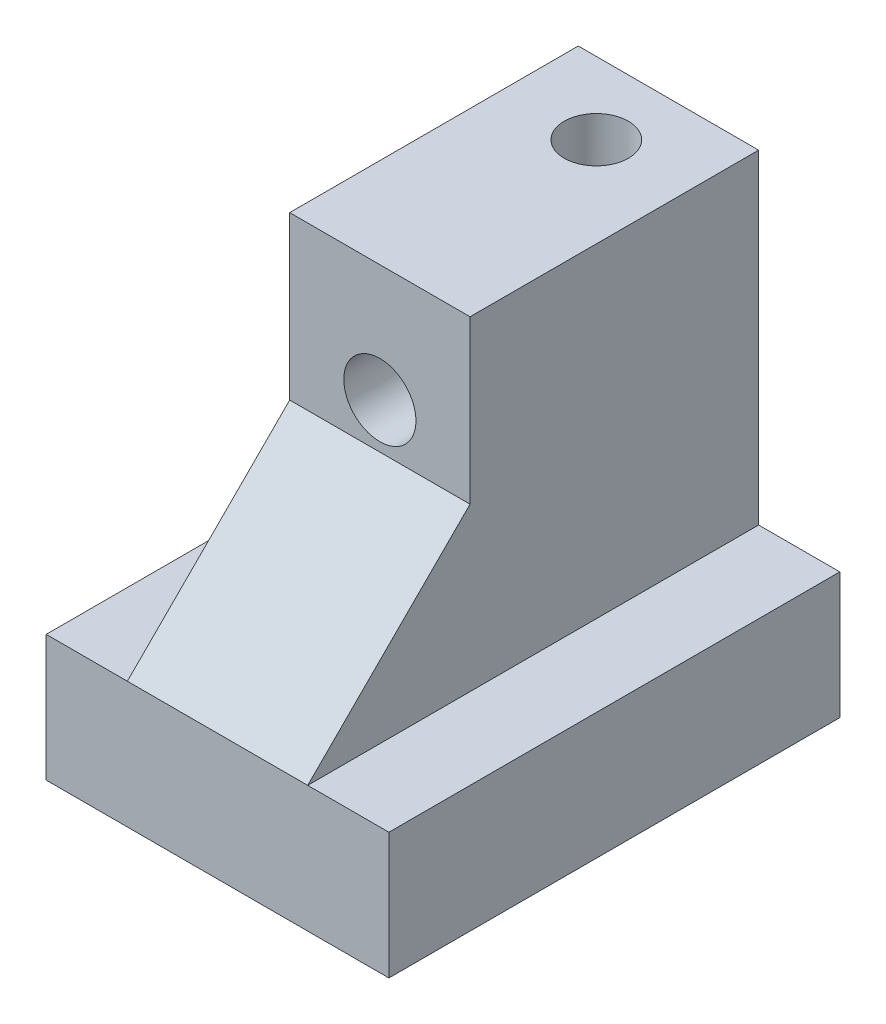
ISO-10303-21;
HEADER;
FILE_DESCRIPTION(('STEP AP214'),'2;1');
FILE_NAME('part.step','',(''),(''),'','','');
FILE_SCHEMA(('AUTOMOTIVE_DESIGN { 1 0 10303 214 1 1 1 1 }'));
ENDSEC;
DATA;
#1=APPLICATION_CONTEXT('core data for automotive mechanical design processes');
#2=APPLICATION_PROTOCOL_DEFINITION('international standard','automotive_design',2000,#1);
#3=PRODUCT_CONTEXT('',#1,'mechanical');
#4=PRODUCT('Part','Part','',(#3));
#5=PRODUCT_RELATED_PRODUCT_CATEGORY('part','',(#4));
#6=PRODUCT_DEFINITION_FORMATION('','',#4);
#7=PRODUCT_DEFINITION_CONTEXT('part definition',#1,'design');
#8=PRODUCT_DEFINITION('design','',#6,#7);
#9=PRODUCT_DEFINITION_SHAPE('','',#8);
#10=(LENGTH_UNIT() NAMED_UNIT(*) SI_UNIT(.MILLI.,.METRE.));
#11=(NAMED_UNIT(*) PLANE_ANGLE_UNIT() SI_UNIT($,.RADIAN.));
#12=(NAMED_UNIT(*) SI_UNIT($,.STERADIAN.) SOLID_ANGLE_UNIT());
#13=UNCERTAINTY_MEASURE_WITH_UNIT(LENGTH_MEASURE(1.E-05),#10,'distance_accuracy_value','');
#14=(GEOMETRIC_REPRESENTATION_CONTEXT(3) GLOBAL_UNCERTAINTY_ASSIGNED_CONTEXT((#13)) GLOBAL_UNIT_ASSIGNED_CONTEXT((#10,
#11,#12)) REPRESENTATION_CONTEXT('',''));
#15=CARTESIAN_POINT('',(0.,0.,0.));
#16=DIRECTION('',(0.,0.,1.));
#17=DIRECTION('',(1.,0.,0.));
#18=AXIS2_PLACEMENT_3D('',#15,#16,#17);
#19=CARTESIAN_POINT('',(-6.0325,2.2225,15.875));
#20=DIRECTION('',(0.,-1.,0.));
#21=DIRECTION('',(0.,0.,-1.));
#22=AXIS2_PLACEMENT_3D('',#19,#20,#21);
#23=PLANE('',#22);
#24=DIRECTION('',(0.,0.,-1.));
#25=VECTOR('',#24,1.);
#26=CARTESIAN_POINT('',(3.175,2.2225,10.16));
#27=LINE('',#26,#25);
#28=CARTESIAN_POINT('',(3.175,2.2225,15.875));
#29=VERTEX_POINT('',#28);
#30=CARTESIAN_POINT('',(3.17499999999999,2.2225,0.));
#31=VERTEX_POINT('',#30);
#32=EDGE_CURVE('E57',#29,#31,#27,.T.);
#33=ORIENTED_EDGE('',*,*,#32,.F.);
#34=DIRECTION('',(-1.,0.,0.));
#35=VECTOR('',#34,1.);
#36=CARTESIAN_POINT('',(-6.0325,2.2225,15.875));
#37=LINE('',#36,#35);
#38=CARTESIAN_POINT('',(6.0325,2.2225,15.875));
#39=VERTEX_POINT('',#38);
#40=EDGE_CURVE('E156',#39,#29,#37,.T.);
#41=ORIENTED_EDGE('',*,*,#40,.F.);
#42=DIRECTION('',(0.,0.,-1.));
#43=VECTOR('',#42,1.);
#44=CARTESIAN_POINT('',(6.0325,2.2225,15.875));
#45=LINE('',#44,#43);
#46=CARTESIAN_POINT('',(6.0325,2.2225,0.));
#47=VERTEX_POINT('',#46);
#48=EDGE_CURVE('E175',#39,#47,#45,.T.);
#49=ORIENTED_EDGE('',*,*,#48,.T.);
#50=DIRECTION('',(-1.,0.,0.));
#51=VECTOR('',#50,1.);
#52=CARTESIAN_POINT('',(-6.0325,2.2225,0.));
#53=LINE('',#52,#51);
#54=EDGE_CURVE('E173',#47,#31,#53,.T.);
#55=ORIENTED_EDGE('',*,*,#54,.T.);
#56=EDGE_LOOP('',(#33,#41,#49,#55));
#57=FACE_BOUND('',#56,.T.);
#58=ADVANCED_FACE('F35',(#57),#23,.F.);
#59=CARTESIAN_POINT('',(-3.175,2.2225,15.875));
#60=VERTEX_POINT('',#59);
#61=CARTESIAN_POINT('',(-6.0325,2.2225,15.875));
#62=VERTEX_POINT('',#61);
#63=EDGE_CURVE('E154',#60,#62,#37,.T.);
#64=ORIENTED_EDGE('',*,*,#63,.F.);
#65=DIRECTION('',(0.,0.,1.));
#66=VECTOR('',#65,1.);
#67=CARTESIAN_POINT('',(-3.175,2.2225,10.16));
#68=LINE('',#67,#66);
#69=CARTESIAN_POINT('',(-3.175,2.2225,0.));
#70=VERTEX_POINT('',#69);
#71=EDGE_CURVE('E49',#70,#60,#68,.T.);
#72=ORIENTED_EDGE('',*,*,#71,.F.);
#73=CARTESIAN_POINT('',(-6.0325,2.2225,0.));
#74=VERTEX_POINT('',#73);
#75=EDGE_CURVE('E130',#70,#74,#53,.T.);
#76=ORIENTED_EDGE('',*,*,#75,.T.);
#77=DIRECTION('',(0.,0.,-1.));
#78=VECTOR('',#77,1.);
#79=CARTESIAN_POINT('',(-6.0325,2.2225,15.875));
#80=LINE('',#79,#78);
#81=EDGE_CURVE('E179',#62,#74,#80,.T.);
#82=ORIENTED_EDGE('',*,*,#81,.F.);
#83=EDGE_LOOP('',(#64,#72,#76,#82));
#84=FACE_BOUND('',#83,.T.);
#85=ADVANCED_FACE('F207',(#84),#23,.F.);
#86=CARTESIAN_POINT('',(6.0325,-2.2225,15.875));
#87=DIRECTION('',(-1.,0.,0.));
#88=DIRECTION('',(0.,0.,1.));
#89=AXIS2_PLACEMENT_3D('',#86,#87,#88);
#90=PLANE('',#89);
#91=DIRECTION('',(0.,1.,0.));
#92=VECTOR('',#91,1.);
#93=CARTESIAN_POINT('',(6.0325,-2.2225,0.));
#94=LINE('',#93,#92);
#95=CARTESIAN_POINT('',(6.0325,-2.2225,0.));
#96=VERTEX_POINT('',#95);
#97=EDGE_CURVE('E127',#96,#47,#94,.T.);
#98=ORIENTED_EDGE('',*,*,#97,.T.);
#99=ORIENTED_EDGE('',*,*,#48,.F.);
#100=DIRECTION('',(0.,1.,0.));
#101=VECTOR('',#100,1.);
#102=CARTESIAN_POINT('',(6.0325,-2.2225,15.875));
#103=LINE('',#102,#101);
#104=CARTESIAN_POINT('',(6.0325,-2.2225,15.875));
#105=VERTEX_POINT('',#104);
#106=EDGE_CURVE('E151',#105,#39,#103,.T.);
#107=ORIENTED_EDGE('',*,*,#106,.F.);
#108=DIRECTION('',(0.,0.,-1.));
#109=VECTOR('',#108,1.);
#110=CARTESIAN_POINT('',(6.0325,-2.2225,15.875));
#111=LINE('',#110,#109);
#112=EDGE_CURVE('E163',#105,#96,#111,.T.);
#113=ORIENTED_EDGE('',*,*,#112,.T.);
#114=EDGE_LOOP('',(#98,#99,#107,#113));
#115=FACE_BOUND('',#114,.T.);
#116=ADVANCED_FACE('F199',(#115),#90,.F.);
#117=CARTESIAN_POINT('',(-6.0325,-2.2225,15.875));
#118=DIRECTION('',(1.,0.,0.));
#119=DIRECTION('',(0.,0.,-1.));
#120=AXIS2_PLACEMENT_3D('',#117,#118,#119);
#121=PLANE('',#120);
#122=DIRECTION('',(0.,-1.,0.));
#123=VECTOR('',#122,1.);
#124=CARTESIAN_POINT('',(-6.0325,-2.2225,0.));
#125=LINE('',#124,#123);
#126=CARTESIAN_POINT('',(-6.0325,-2.2225,0.));
#127=VERTEX_POINT('',#126);
#128=EDGE_CURVE('E167',#74,#127,#125,.T.);
#129=ORIENTED_EDGE('',*,*,#128,.T.);
#130=DIRECTION('',(0.,0.,-1.));
#131=VECTOR('',#130,1.);
#132=CARTESIAN_POINT('',(-6.0325,-2.2225,15.875));
#133=LINE('',#132,#131);
#134=CARTESIAN_POINT('',(-6.0325,-2.2225,15.875));
#135=VERTEX_POINT('',#134);
#136=EDGE_CURVE('E182',#135,#127,#133,.T.);
#137=ORIENTED_EDGE('',*,*,#136,.F.);
#138=DIRECTION('',(0.,-1.,0.));
#139=VECTOR('',#138,1.);
#140=CARTESIAN_POINT('',(-6.0325,-2.2225,15.875));
#141=LINE('',#140,#139);
#142=EDGE_CURVE('E159',#62,#135,#141,.T.);
#143=ORIENTED_EDGE('',*,*,#142,.F.);
#144=ORIENTED_EDGE('',*,*,#81,.T.);
#145=EDGE_LOOP('',(#129,#137,#143,#144));
#146=FACE_BOUND('',#145,.T.);
#147=ADVANCED_FACE('F192',(#146),#121,.F.);
#148=CARTESIAN_POINT('',(-6.0325,-2.2225,15.875));
#149=DIRECTION('',(0.,1.,0.));
#150=DIRECTION('',(0.,0.,1.));
#151=AXIS2_PLACEMENT_3D('',#148,#149,#150);
#152=PLANE('',#151);
#153=DIRECTION('',(1.,0.,0.));
#154=VECTOR('',#153,1.);
#155=CARTESIAN_POINT('',(-6.0325,-2.2225,0.));
#156=LINE('',#155,#154);
#157=EDGE_CURVE('E155',#127,#96,#156,.T.);
#158=ORIENTED_EDGE('',*,*,#157,.T.);
#159=ORIENTED_EDGE('',*,*,#112,.F.);
#160=DIRECTION('',(1.,0.,0.));
#161=VECTOR('',#160,1.);
#162=CARTESIAN_POINT('',(-6.0325,-2.2225,15.875));
#163=LINE('',#162,#161);
#164=EDGE_CURVE('E162',#135,#105,#163,.T.);
#165=ORIENTED_EDGE('',*,*,#164,.F.);
#166=ORIENTED_EDGE('',*,*,#136,.T.);
#167=EDGE_LOOP('',(#158,#159,#165,#166));
#168=FACE_BOUND('',#167,.T.);
#169=ADVANCED_FACE('F196',(#168),#152,.F.);
#170=CARTESIAN_POINT('',(0.,0.,15.875));
#171=DIRECTION('',(0.,0.,-1.));
#172=DIRECTION('',(-1.,0.,0.));
#173=AXIS2_PLACEMENT_3D('',#170,#171,#172);
#174=PLANE('',#173);
#175=ORIENTED_EDGE('',*,*,#106,.T.);
#176=ORIENTED_EDGE('',*,*,#40,.T.);
#177=EDGE_CURVE('E160',#29,#60,#37,.T.);
#178=ORIENTED_EDGE('',*,*,#177,.T.);
#179=ORIENTED_EDGE('',*,*,#63,.T.);
#180=ORIENTED_EDGE('',*,*,#142,.T.);
#181=ORIENTED_EDGE('',*,*,#164,.T.);
#182=EDGE_LOOP('',(#175,#176,#178,#179,#180,#181));
#183=FACE_BOUND('',#182,.T.);
#184=ADVANCED_FACE('F202',(#183),#174,.F.);
#185=CARTESIAN_POINT('',(0.,0.,0.));
#186=DIRECTION('',(0.,0.,-1.));
#187=DIRECTION('',(-1.,0.,0.));
#188=AXIS2_PLACEMENT_3D('',#185,#186,#187);
#189=PLANE('',#188);
#190=CARTESIAN_POINT('',(0.,9.525,0.));
#191=DIRECTION('',(0.,0.,-1.));
#192=DIRECTION('',(-1.,0.,0.));
#193=AXIS2_PLACEMENT_3D('',#190,#191,#192);
#194=CIRCLE('',#193,1.27);
#195=CARTESIAN_POINT('',(-1.27,9.525,0.));
#196=VERTEX_POINT('',#195);
#197=EDGE_CURVE('E211',#196,#196,#194,.T.);
#198=ORIENTED_EDGE('',*,*,#197,.F.);
#199=EDGE_LOOP('',(#198));
#200=FACE_BOUND('',#199,.T.);
#201=ORIENTED_EDGE('',*,*,#97,.F.);
#202=ORIENTED_EDGE('',*,*,#157,.F.);
#203=ORIENTED_EDGE('',*,*,#128,.F.);
#204=ORIENTED_EDGE('',*,*,#75,.F.);
#205=DIRECTION('',(0.,-1.,0.));
#206=VECTOR('',#205,1.);
#207=CARTESIAN_POINT('',(-3.175,13.6525,0.));
#208=LINE('',#207,#206);
#209=CARTESIAN_POINT('',(-3.175,13.6525,0.));
#210=VERTEX_POINT('',#209);
#211=EDGE_CURVE('E112',#210,#70,#208,.T.);
#212=ORIENTED_EDGE('',*,*,#211,.F.);
#213=DIRECTION('',(-1.,0.,0.));
#214=VECTOR('',#213,1.);
#215=CARTESIAN_POINT('',(-3.175,13.6525,0.));
#216=LINE('',#215,#214);
#217=CARTESIAN_POINT('',(3.175,13.6525,0.));
#218=VERTEX_POINT('',#217);
#219=EDGE_CURVE('E105',#218,#210,#216,.T.);
#220=ORIENTED_EDGE('',*,*,#219,.F.);
#221=DIRECTION('',(0.,-1.,0.));
#222=VECTOR('',#221,1.);
#223=CARTESIAN_POINT('',(3.175,13.6525,0.));
#224=LINE('',#223,#222);
#225=EDGE_CURVE('E110',#218,#31,#224,.T.);
#226=ORIENTED_EDGE('',*,*,#225,.T.);
#227=ORIENTED_EDGE('',*,*,#54,.F.);
#228=EDGE_LOOP('',(#201,#202,#203,#204,#212,#220,#226,#227));
#229=FACE_BOUND('',#228,.T.);
#230=ADVANCED_FACE('F108',(#200,#229),#189,.T.);
#231=CARTESIAN_POINT('',(3.175,13.6525,10.16));
#232=DIRECTION('',(-1.,0.,0.));
#233=DIRECTION('',(0.,0.,1.));
#234=AXIS2_PLACEMENT_3D('',#231,#232,#233);
#235=PLANE('',#234);
#236=ORIENTED_EDGE('',*,*,#32,.T.);
#237=ORIENTED_EDGE('',*,*,#225,.F.);
#238=DIRECTION('',(0.,0.,-1.));
#239=VECTOR('',#238,1.);
#240=CARTESIAN_POINT('',(3.175,13.6525,10.16));
#241=LINE('',#240,#239);
#242=CARTESIAN_POINT('',(3.175,13.6525,10.16));
#243=VERTEX_POINT('',#242);
#244=EDGE_CURVE('E116',#243,#218,#241,.T.);
#245=ORIENTED_EDGE('',*,*,#244,.F.);
#246=DIRECTION('',(0.,-1.,0.));
#247=VECTOR('',#246,1.);
#248=CARTESIAN_POINT('',(3.175,13.6525,10.16));
#249=LINE('',#248,#247);
#250=CARTESIAN_POINT('',(3.175,7.93750000000003,10.16));
#251=VERTEX_POINT('',#250);
#252=EDGE_CURVE('E147',#243,#251,#249,.T.);
#253=ORIENTED_EDGE('',*,*,#252,.T.);
#254=DIRECTION('',(0.,0.707106781186551,-0.707106781186544));
#255=VECTOR('',#254,1.);
#256=CARTESIAN_POINT('',(3.175,10.795,7.30250000000002));
#257=LINE('',#256,#255);
#258=EDGE_CURVE('E43',#251,#29,#257,.F.);
#259=ORIENTED_EDGE('',*,*,#258,.T.);
#260=EDGE_LOOP('',(#236,#237,#245,#253,#259));
#261=FACE_BOUND('',#260,.T.);
#262=ADVANCED_FACE('F126',(#261),#235,.F.);
#263=CARTESIAN_POINT('',(-3.175,13.6525,10.16));
#264=DIRECTION('',(1.,0.,0.));
#265=DIRECTION('',(0.,0.,-1.));
#266=AXIS2_PLACEMENT_3D('',#263,#264,#265);
#267=PLANE('',#266);
#268=ORIENTED_EDGE('',*,*,#71,.T.);
#269=DIRECTION('',(0.,-0.707106781186551,0.707106781186544));
#270=VECTOR('',#269,1.);
#271=CARTESIAN_POINT('',(-3.175,10.795,7.30250000000002));
#272=LINE('',#271,#270);
#273=CARTESIAN_POINT('',(-3.175,7.93750000000003,10.16));
#274=VERTEX_POINT('',#273);
#275=EDGE_CURVE('E11',#60,#274,#272,.F.);
#276=ORIENTED_EDGE('',*,*,#275,.T.);
#277=DIRECTION('',(0.,-1.,0.));
#278=VECTOR('',#277,1.);
#279=CARTESIAN_POINT('',(-3.175,13.6525,10.16));
#280=LINE('',#279,#278);
#281=CARTESIAN_POINT('',(-3.175,13.6525,10.16));
#282=VERTEX_POINT('',#281);
#283=EDGE_CURVE('E132',#282,#274,#280,.T.);
#284=ORIENTED_EDGE('',*,*,#283,.F.);
#285=DIRECTION('',(0.,0.,1.));
#286=VECTOR('',#285,1.);
#287=CARTESIAN_POINT('',(-3.175,13.6525,10.16));
#288=LINE('',#287,#286);
#289=EDGE_CURVE('E115',#210,#282,#288,.T.);
#290=ORIENTED_EDGE('',*,*,#289,.F.);
#291=ORIENTED_EDGE('',*,*,#211,.T.);
#292=EDGE_LOOP('',(#268,#276,#284,#290,#291));
#293=FACE_BOUND('',#292,.T.);
#294=ADVANCED_FACE('F208',(#293),#267,.F.);
#295=CARTESIAN_POINT('',(-3.175,13.6525,10.16));
#296=DIRECTION('',(0.,0.,-1.));
#297=DIRECTION('',(-1.,0.,0.));
#298=AXIS2_PLACEMENT_3D('',#295,#296,#297);
#299=PLANE('',#298);
#300=CARTESIAN_POINT('',(0.,9.525,10.16));
#301=DIRECTION('',(0.,0.,-1.));
#302=DIRECTION('',(-1.,0.,0.));
#303=AXIS2_PLACEMENT_3D('',#300,#301,#302);
#304=CIRCLE('',#303,1.27);
#305=CARTESIAN_POINT('',(-1.27,9.525,10.16));
#306=VERTEX_POINT('',#305);
#307=EDGE_CURVE('E141',#306,#306,#304,.T.);
#308=ORIENTED_EDGE('',*,*,#307,.T.);
#309=EDGE_LOOP('',(#308));
#310=FACE_BOUND('',#309,.T.);
#311=ORIENTED_EDGE('',*,*,#283,.T.);
#312=DIRECTION('',(1.,0.,0.));
#313=VECTOR('',#312,1.);
#314=CARTESIAN_POINT('',(3.175,7.93750000000003,10.16));
#315=LINE('',#314,#313);
#316=EDGE_CURVE('E178',#274,#251,#315,.T.);
#317=ORIENTED_EDGE('',*,*,#316,.T.);
#318=ORIENTED_EDGE('',*,*,#252,.F.);
#319=DIRECTION('',(1.,0.,0.));
#320=VECTOR('',#319,1.);
#321=CARTESIAN_POINT('',(-3.175,13.6525,10.16));
#322=LINE('',#321,#320);
#323=EDGE_CURVE('E121',#282,#243,#322,.T.);
#324=ORIENTED_EDGE('',*,*,#323,.F.);
#325=EDGE_LOOP('',(#311,#317,#318,#324));
#326=FACE_BOUND('',#325,.T.);
#327=ADVANCED_FACE('F263',(#310,#326),#299,.F.);
#328=CARTESIAN_POINT('',(0.,13.6525,0.));
#329=DIRECTION('',(0.,-1.,0.));
#330=DIRECTION('',(0.,0.,-1.));
#331=AXIS2_PLACEMENT_3D('',#328,#329,#330);
#332=PLANE('',#331);
#333=CARTESIAN_POINT('',(0.,13.6525,2.54));
#334=DIRECTION('',(0.,1.,0.));
#335=DIRECTION('',(0.,0.,1.));
#336=AXIS2_PLACEMENT_3D('',#333,#334,#335);
#337=CIRCLE('',#336,1.13029999999999);
#338=CARTESIAN_POINT('',(0.,13.6525,3.67029999999999));
#339=VERTEX_POINT('',#338);
#340=EDGE_CURVE('E221',#339,#339,#337,.T.);
#341=ORIENTED_EDGE('',*,*,#340,.F.);
#342=EDGE_LOOP('',(#341));
#343=FACE_BOUND('',#342,.T.);
#344=ORIENTED_EDGE('',*,*,#244,.T.);
#345=ORIENTED_EDGE('',*,*,#219,.T.);
#346=ORIENTED_EDGE('',*,*,#289,.T.);
#347=ORIENTED_EDGE('',*,*,#323,.T.);
#348=EDGE_LOOP('',(#344,#345,#346,#347));
#349=FACE_BOUND('',#348,.T.);
#350=ADVANCED_FACE('F119',(#343,#349),#332,.F.);
#351=CARTESIAN_POINT('',(0.,9.525,15.875));
#352=DIRECTION('',(0.,0.,-1.));
#353=DIRECTION('',(-1.,0.,0.));
#354=AXIS2_PLACEMENT_3D('',#351,#352,#353);
#355=CYLINDRICAL_SURFACE('',#354,1.27);
#356=CARTESIAN_POINT('',(0.,10.795,3.67029999999999));
#357=CARTESIAN_POINT('',(0.0525214488881809,10.7949956889699,3.6702956249461));
#358=CARTESIAN_POINT('',(0.105118560895679,10.7917091381884,3.66660626555714));
#359=CARTESIAN_POINT('',(0.208583212691276,10.778844621461,3.65212185829814));
#360=CARTESIAN_POINT('',(0.259446677815284,10.7692527821927,3.64131114142573));
#361=CARTESIAN_POINT('',(0.357622274200163,10.7446518458602,3.61343904594019));
#362=CARTESIAN_POINT('',(0.404956120569466,10.7296798706134,3.59642048828165));
#363=CARTESIAN_POINT('',(0.495580758055982,10.6953218834413,3.55706587316357));
#364=CARTESIAN_POINT('',(0.538871192807762,10.675935482968,3.53472934762033));
#365=CARTESIAN_POINT('',(0.637191764307581,10.625464973188,3.47595519796252));
#366=CARTESIAN_POINT('',(0.690147397514108,10.592778198944,3.43742601288566));
#367=CARTESIAN_POINT('',(0.787324093311642,10.5232997391207,3.35353583426314));
#368=CARTESIAN_POINT('',(0.831522068166154,10.4864975930557,3.30815732384643));
#369=CARTESIAN_POINT('',(0.912191085664217,10.4104095356176,3.21051533324903));
#370=CARTESIAN_POINT('',(0.9484632231662,10.3710861458899,3.15811858636531));
#371=CARTESIAN_POINT('',(1.01208279041999,10.2938006888716,3.04730206300028));
#372=CARTESIAN_POINT('',(1.03944973693741,10.2558358091397,2.98889583214411));
#373=CARTESIAN_POINT('',(1.07346606134102,10.2039804182722,2.8954601192381));
#374=CARTESIAN_POINT('',(1.08366374277073,10.1874782078818,2.86317718993052));
#375=CARTESIAN_POINT('',(1.10135919552285,10.157618224017,2.79646677100185));
#376=CARTESIAN_POINT('',(1.10886079509831,10.1442560013873,2.76204240426422));
#377=CARTESIAN_POINT('',(1.11975231241879,10.1243032859703,2.69694610664333));
#378=CARTESIAN_POINT('',(1.12361677945344,10.1169587349812,2.66659387103535));
#379=CARTESIAN_POINT('',(1.12885436291002,10.1069125281793,2.60494237258425));
#380=CARTESIAN_POINT('',(1.13023302807281,10.1042005324143,2.57364537790904));
#381=CARTESIAN_POINT('',(1.13036234016959,10.1039482410446,2.51093153537892));
#382=CARTESIAN_POINT('',(1.12910529823774,10.1064230764173,2.47951460448217));
#383=CARTESIAN_POINT('',(1.12408452878399,10.1160681152857,2.41759749843621));
#384=CARTESIAN_POINT('',(1.12031541335616,10.1232484105163,2.38709944136288));
#385=CARTESIAN_POINT('',(1.10810188272219,10.1456769212406,2.31250010477098));
#386=CARTESIAN_POINT('',(1.09825662624159,10.1631692473346,2.26932758398668));
#387=CARTESIAN_POINT('',(1.07439032953409,10.2025834736957,2.18623854309111));
#388=CARTESIAN_POINT('',(1.06035171138145,10.2245238927728,2.14633664846683));
#389=CARTESIAN_POINT('',(1.03046084673378,10.2677360284982,2.07410392246356));
#390=CARTESIAN_POINT('',(1.01503946434625,10.2887621836829,2.04144359057309));
#391=CARTESIAN_POINT('',(0.981391583308486,10.3315445006004,1.97809639810443));
#392=CARTESIAN_POINT('',(0.963163183142763,10.3533011493092,1.94741089543491));
#393=CARTESIAN_POINT('',(0.904319002742329,10.4186029589042,1.85818876794645));
#394=CARTESIAN_POINT('',(0.859501886070888,10.4622454449365,1.80238549433975));
#395=CARTESIAN_POINT('',(0.767904941342108,10.5379566851545,1.70852392177515));
#396=CARTESIAN_POINT('',(0.723047727039503,10.5706665282719,1.66909677580016));
#397=CARTESIAN_POINT('',(0.625716347822425,10.6316428214997,1.59675111307516));
#398=CARTESIAN_POINT('',(0.573257241322171,10.6599178311162,1.5638200260468));
#399=CARTESIAN_POINT('',(0.473038714222409,10.7046085414779,1.51224497630337));
#400=CARTESIAN_POINT('',(0.42663553188066,10.722267659223,1.49205229615996));
#401=CARTESIAN_POINT('',(0.330025274023096,10.7524105528952,1.45774189413325));
#402=CARTESIAN_POINT('',(0.279820429670032,10.7648973369996,1.44362064098713));
#403=CARTESIAN_POINT('',(0.176464941364406,10.7837830621604,1.42230707051812));
#404=CARTESIAN_POINT('',(0.123297186612742,10.7901416748194,1.41516064946465));
#405=CARTESIAN_POINT('',(0.0161139022446039,10.7960295639557,1.40854218215039));
#406=CARTESIAN_POINT('',(-0.0379012471004081,10.7955618208949,1.40906678663574));
#407=CARTESIAN_POINT('',(-0.139148636848004,10.7882660723555,1.41727034617499));
#408=CARTESIAN_POINT('',(-0.186495744026937,10.7821136191797,1.42418942229792));
#409=CARTESIAN_POINT('',(-0.279063625583083,10.7648554382749,1.44366979696205));
#410=CARTESIAN_POINT('',(-0.324284002395898,10.7537487884603,1.45623214584435));
#411=CARTESIAN_POINT('',(-0.413548481747416,10.7267258781564,1.48696660387778));
#412=CARTESIAN_POINT('',(-0.457461558669392,10.7106257682946,1.50535385232133));
#413=CARTESIAN_POINT('',(-0.541414254241931,10.6747215535255,1.54670150510677));
#414=CARTESIAN_POINT('',(-0.581452477134502,10.6549161214063,1.56966354828941));
#415=CARTESIAN_POINT('',(-0.67676446096404,10.6016597080169,1.63210917887357));
#416=CARTESIAN_POINT('',(-0.729421088049056,10.5663940674307,1.67405350393301));
#417=CARTESIAN_POINT('',(-0.82539224361578,10.4921266903149,1.76495045491123));
#418=CARTESIAN_POINT('',(-0.868672587565448,10.4531120072626,1.81392767779622));
#419=CARTESIAN_POINT('',(-0.946917181747378,10.373185871539,1.91924312439423));
#420=CARTESIAN_POINT('',(-0.981665940524423,10.3322514194515,1.97572539816323));
#421=CARTESIAN_POINT('',(-1.02643177916621,10.2732999200106,2.06552748598224));
#422=CARTESIAN_POINT('',(-1.04011629339532,10.2540779288665,2.09627072919016));
#423=CARTESIAN_POINT('',(-1.06494586631163,10.2172993305634,2.1596991373533));
#424=CARTESIAN_POINT('',(-1.07609408900676,10.1997406645622,2.19238181794831));
#425=CARTESIAN_POINT('',(-1.09462499498842,10.1691915374536,2.25650463171795));
#426=CARTESIAN_POINT('',(-1.1022767678146,10.1559171492192,2.28772783799542));
#427=CARTESIAN_POINT('',(-1.11503151644114,10.133092120181,2.35198095408497));
#428=CARTESIAN_POINT('',(-1.12014061650876,10.1235325442057,2.385006308047));
#429=CARTESIAN_POINT('',(-1.12747605871444,10.1096071104405,2.45306040449363));
#430=CARTESIAN_POINT('',(-1.12965698464675,10.105323160172,2.48811210511683));
#431=CARTESIAN_POINT('',(-1.13069557623857,10.1032994265232,2.55844147080103));
#432=CARTESIAN_POINT('',(-1.12955569540626,10.1055548116866,2.59371894983141));
#433=CARTESIAN_POINT('',(-1.12397794632735,10.1162752370823,2.66489368094221));
#434=CARTESIAN_POINT('',(-1.11936941160543,10.125061315495,2.70072559165881));
#435=CARTESIAN_POINT('',(-1.10713653955917,10.1473425663578,2.77040566521106));
#436=CARTESIAN_POINT('',(-1.0995000537621,10.1608566821958,2.80424519845106));
#437=CARTESIAN_POINT('',(-1.07474173413593,10.2023216186688,2.89517905739508));
#438=CARTESIAN_POINT('',(-1.05484770965195,10.2333654020994,2.95006739065219));
#439=CARTESIAN_POINT('',(-1.00798741067111,10.2986303396484,3.05460747828605));
#440=CARTESIAN_POINT('',(-0.981006494353578,10.3328579760698,3.10424808934044));
#441=CARTESIAN_POINT('',(-0.916929394711384,10.4051770699242,3.20383382860287));
#442=CARTESIAN_POINT('',(-0.879072277037107,10.443299598817,3.25327199225568));
#443=CARTESIAN_POINT('',(-0.794753451681264,10.5171734902113,3.34614231181438));
#444=CARTESIAN_POINT('',(-0.748305139697298,10.5529284280695,3.38958363653552));
#445=CARTESIAN_POINT('',(-0.655212241199115,10.6141080228183,3.46258189942081));
#446=CARTESIAN_POINT('',(-0.609919806662203,10.640258135538,3.49324494509146));
#447=CARTESIAN_POINT('',(-0.51344774650809,10.6878211771917,3.54847820414197));
#448=CARTESIAN_POINT('',(-0.462272409086636,10.7092375238197,3.57305281482197));
#449=CARTESIAN_POINT('',(-0.36346359427817,10.7428119408487,3.61136085369049));
#450=CARTESIAN_POINT('',(-0.316578630958144,10.7559040320674,3.62620094370426));
#451=CARTESIAN_POINT('',(-0.220202391218471,10.7767288854728,3.64974499361277));
#452=CARTESIAN_POINT('',(-0.17071789957394,10.7844749193521,3.65846414977727));
#453=CARTESIAN_POINT('',(-0.100673787173612,10.7911637574963,3.66598818221335));
#454=CARTESIAN_POINT('',(-0.0806051310708372,10.7925994115549,3.66760215490208));
#455=CARTESIAN_POINT('',(-0.0403613899479579,10.7945184613342,3.66975901711325));
#456=CARTESIAN_POINT('',(-0.0201862834524728,10.7950016569169,3.67030168152402));
#457=CARTESIAN_POINT('',(0.,10.795,3.67029999999999));
#458=B_SPLINE_CURVE_WITH_KNOTS('',3,(#356,#357,#358,#359,#360,#361,#362,#363,#364,#365,#366,
#367,#368,#369,#370,#371,#372,#373,#374,#375,#376,#377,#378,#379,#380,#381,#382,#383,#384,#385,
#386,#387,#388,#389,#390,#391,#392,#393,#394,#395,#396,#397,#398,#399,#400,#401,#402,#403,#404,
#405,#406,#407,#408,#409,#410,#411,#412,#413,#414,#415,#416,#417,#418,#419,#420,#421,#422,#423,
#424,#425,#426,#427,#428,#429,#430,#431,#432,#433,#434,#435,#436,#437,#438,#439,#440,#441,#442,
#443,#444,#445,#446,#447,#448,#449,#450,#451,#452,#453,#454,#455,#456,#457),.UNSPECIFIED.,.T.,
.F.,(4,2,2,2,2,2,2,2,2,2,2,2,2,2,2,2,2,2,2,2,2,2,2,2,2,2,2,2,2,2,2,2,2,2,2,2,2,2,2,2,2,2,2,2,2,
2,2,2,2,2,4),(0.,0.157474224768566,0.315296099954664,0.472049311635395,0.628816325724567,
0.847207138003268,1.06616624808233,1.29011212364235,1.51356383722979,1.62636119088525,
1.7389977412113,1.83302494663633,1.92684200596509,2.02093312846651,2.11522671023779,
2.25725135027552,2.39987989611006,2.52509005167707,2.65038540264546,2.90059741521381,
3.10417533079093,3.30735536047641,3.46752092762743,3.62759321286245,3.78871185420261,
3.9497601514788,4.09383434691634,4.23793536894782,4.38814213804593,4.53840281317664,
4.76513957721409,4.99268957404159,5.22550247938436,5.3416492729493,5.45765036976284,
5.56174191202768,5.66558151172035,5.7710137528755,5.87636811739769,5.98727559576081,
6.09863262414826,6.29592220647794,6.49362264821719,6.71191787057084,6.92987554547379,
7.11110312187847,7.29219942472667,7.44424814577304,7.59591803185041,7.65642953063588,
7.71695374321814),.UNSPECIFIED.);
#459=CARTESIAN_POINT('',(0.,10.795,3.67029999999999));
#460=VERTEX_POINT('',#459);
#461=EDGE_CURVE('E214',#460,#460,#458,.T.);
#462=ORIENTED_EDGE('',*,*,#461,.T.);
#463=EDGE_LOOP('',(#462));
#464=FACE_BOUND('',#463,.T.);
#465=ORIENTED_EDGE('',*,*,#197,.T.);
#466=EDGE_LOOP('',(#465));
#467=FACE_BOUND('',#466,.T.);
#468=ORIENTED_EDGE('',*,*,#307,.F.);
#469=EDGE_LOOP('',(#468));
#470=FACE_BOUND('',#469,.T.);
#471=ADVANCED_FACE('F227',(#464,#467,#470),#355,.F.);
#472=CARTESIAN_POINT('',(0.,13.6525,2.54));
#473=DIRECTION('',(0.,1.,0.));
#474=DIRECTION('',(0.,0.,1.));
#475=AXIS2_PLACEMENT_3D('',#472,#473,#474);
#476=CYLINDRICAL_SURFACE('',#475,1.13029999999999);
#477=ORIENTED_EDGE('',*,*,#461,.F.);
#478=EDGE_LOOP('',(#477));
#479=FACE_BOUND('',#478,.T.);
#480=ORIENTED_EDGE('',*,*,#340,.T.);
#481=EDGE_LOOP('',(#480));
#482=FACE_BOUND('',#481,.T.);
#483=ADVANCED_FACE('F224',(#479,#482),#476,.F.);
#484=CARTESIAN_POINT('',(-3.175,7.93750000000003,10.16));
#485=DIRECTION('',(0.,0.707106781186544,0.707106781186551));
#486=DIRECTION('',(-1.,0.,0.));
#487=AXIS2_PLACEMENT_3D('',#484,#485,#486);
#488=PLANE('',#487);
#489=ORIENTED_EDGE('',*,*,#275,.F.);
#490=ORIENTED_EDGE('',*,*,#177,.F.);
#491=ORIENTED_EDGE('',*,*,#258,.F.);
#492=ORIENTED_EDGE('',*,*,#316,.F.);
#493=EDGE_LOOP('',(#489,#490,#491,#492));
#494=FACE_BOUND('',#493,.T.);
#495=ADVANCED_FACE('F37',(#494),#488,.T.);
#496=CLOSED_SHELL('',(#58,#85,#116,#147,#169,#184,#230,#262,#294,#327,#350,#471,#483,#495));
#497=MANIFOLD_SOLID_BREP('B2',#496);
#498=ADVANCED_BREP_SHAPE_REPRESENTATION('',(#18,#497),#14);
#499=SHAPE_DEFINITION_REPRESENTATION(#9,#498);
ENDSEC;
END-ISO-10303-21;
